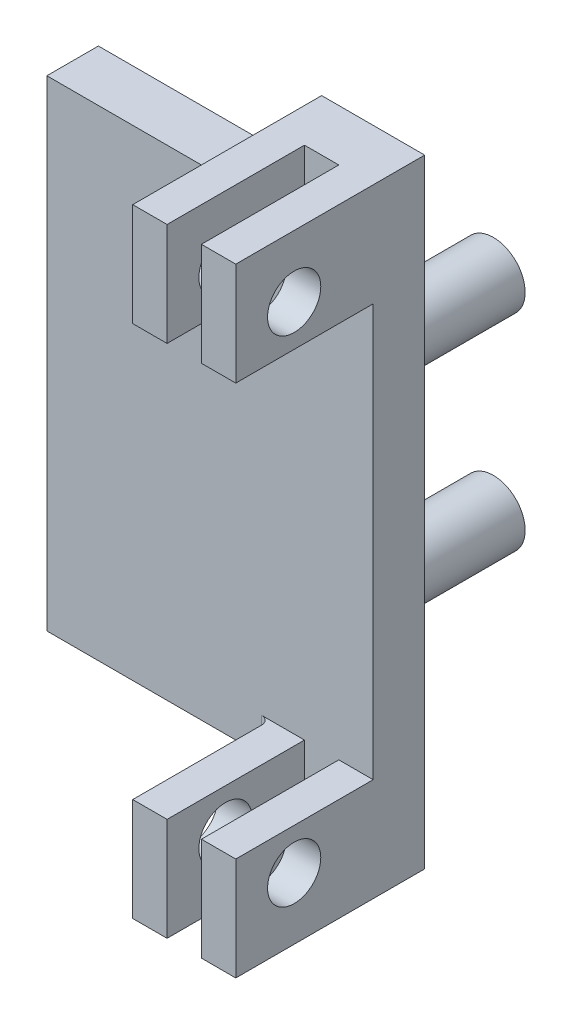
ISO-10303-21;
HEADER;
FILE_DESCRIPTION(('STEP AP214'),'2;1');
FILE_NAME('part.step','',(''),(''),'','','');
FILE_SCHEMA(('AUTOMOTIVE_DESIGN { 1 0 10303 214 1 1 1 1 }'));
ENDSEC;
DATA;
#1=APPLICATION_CONTEXT('core data for automotive mechanical design processes');
#2=APPLICATION_PROTOCOL_DEFINITION('international standard','automotive_design',2000,#1);
#3=PRODUCT_CONTEXT('',#1,'mechanical');
#4=PRODUCT('Part','Part','',(#3));
#5=PRODUCT_RELATED_PRODUCT_CATEGORY('part','',(#4));
#6=PRODUCT_DEFINITION_FORMATION('','',#4);
#7=PRODUCT_DEFINITION_CONTEXT('part definition',#1,'design');
#8=PRODUCT_DEFINITION('design','',#6,#7);
#9=PRODUCT_DEFINITION_SHAPE('','',#8);
#10=(LENGTH_UNIT() NAMED_UNIT(*) SI_UNIT(.MILLI.,.METRE.));
#11=(NAMED_UNIT(*) PLANE_ANGLE_UNIT() SI_UNIT($,.RADIAN.));
#12=(NAMED_UNIT(*) SI_UNIT($,.STERADIAN.) SOLID_ANGLE_UNIT());
#13=UNCERTAINTY_MEASURE_WITH_UNIT(LENGTH_MEASURE(1.E-05),#10,'distance_accuracy_value','');
#14=(GEOMETRIC_REPRESENTATION_CONTEXT(3) GLOBAL_UNCERTAINTY_ASSIGNED_CONTEXT((#13)) GLOBAL_UNIT_ASSIGNED_CONTEXT((#10,
#11,#12)) REPRESENTATION_CONTEXT('',''));
#15=CARTESIAN_POINT('',(0.,0.,0.));
#16=DIRECTION('',(0.,0.,1.));
#17=DIRECTION('',(1.,0.,0.));
#18=AXIS2_PLACEMENT_3D('',#15,#16,#17);
#19=CARTESIAN_POINT('',(0.,0.,3.));
#20=DIRECTION('',(0.,0.,1.));
#21=DIRECTION('',(1.,0.,0.));
#22=AXIS2_PLACEMENT_3D('',#19,#20,#21);
#23=PLANE('',#22);
#24=DIRECTION('',(1.,0.,0.));
#25=VECTOR('',#24,1.);
#26=CARTESIAN_POINT('',(0.,12.,3.));
#27=LINE('',#26,#25);
#28=CARTESIAN_POINT('',(52.50000000001,12.,3.));
#29=VERTEX_POINT('',#28);
#30=CARTESIAN_POINT('',(55.00000000001,12.,3.));
#31=VERTEX_POINT('',#30);
#32=EDGE_CURVE('E186',#29,#31,#27,.T.);
#33=ORIENTED_EDGE('',*,*,#32,.F.);
#34=DIRECTION('',(0.,-1.,0.));
#35=VECTOR('',#34,1.);
#36=CARTESIAN_POINT('',(52.50000000001,14.00000000001,3.));
#37=LINE('',#36,#35);
#38=CARTESIAN_POINT('',(52.50000000001,14.00000000001,3.));
#39=VERTEX_POINT('',#38);
#40=EDGE_CURVE('E382',#29,#39,#37,.F.);
#41=ORIENTED_EDGE('',*,*,#40,.T.);
#42=DIRECTION('',(1.,0.,0.));
#43=VECTOR('',#42,1.);
#44=CARTESIAN_POINT('',(0.,14.00000000001,3.));
#45=LINE('',#44,#43);
#46=CARTESIAN_POINT('',(40.00000000001,14.00000000001,3.));
#47=VERTEX_POINT('',#46);
#48=EDGE_CURVE('E326',#47,#39,#45,.T.);
#49=ORIENTED_EDGE('',*,*,#48,.F.);
#50=DIRECTION('',(0.,1.,0.));
#51=VECTOR('',#50,1.);
#52=CARTESIAN_POINT('',(40.00000000001,0.,3.));
#53=LINE('',#52,#51);
#54=CARTESIAN_POINT('',(40.00000000001,-14.00000000001,3.));
#55=VERTEX_POINT('',#54);
#56=EDGE_CURVE('E329',#55,#47,#53,.T.);
#57=ORIENTED_EDGE('',*,*,#56,.F.);
#58=DIRECTION('',(1.,0.,0.));
#59=VECTOR('',#58,1.);
#60=CARTESIAN_POINT('',(0.,-14.00000000001,3.));
#61=LINE('',#60,#59);
#62=CARTESIAN_POINT('',(52.50000000001,-14.00000000001,3.));
#63=VERTEX_POINT('',#62);
#64=EDGE_CURVE('E320',#55,#63,#61,.T.);
#65=ORIENTED_EDGE('',*,*,#64,.T.);
#66=DIRECTION('',(0.,-1.,0.));
#67=VECTOR('',#66,1.);
#68=CARTESIAN_POINT('',(52.50000000001,-12.,3.));
#69=LINE('',#68,#67);
#70=CARTESIAN_POINT('',(52.50000000001,-12.,3.));
#71=VERTEX_POINT('',#70);
#72=EDGE_CURVE('E379',#63,#71,#69,.F.);
#73=ORIENTED_EDGE('',*,*,#72,.T.);
#74=DIRECTION('',(-1.,0.,0.));
#75=VECTOR('',#74,1.);
#76=CARTESIAN_POINT('',(0.,-12.,3.));
#77=LINE('',#76,#75);
#78=CARTESIAN_POINT('',(55.00000000001,-12.,3.));
#79=VERTEX_POINT('',#78);
#80=EDGE_CURVE('E244',#79,#71,#77,.T.);
#81=ORIENTED_EDGE('',*,*,#80,.F.);
#82=DIRECTION('',(0.,1.,0.));
#83=VECTOR('',#82,1.);
#84=CARTESIAN_POINT('',(55.00000000001,0.,3.));
#85=LINE('',#84,#83);
#86=CARTESIAN_POINT('',(55.00000000001,-18.,3.));
#87=VERTEX_POINT('',#86);
#88=EDGE_CURVE('E239',#87,#79,#85,.T.);
#89=ORIENTED_EDGE('',*,*,#88,.F.);
#90=DIRECTION('',(1.,0.,0.));
#91=VECTOR('',#90,1.);
#92=CARTESIAN_POINT('',(0.,-18.,3.));
#93=LINE('',#92,#91);
#94=CARTESIAN_POINT('',(57.00000000001,-18.,3.));
#95=VERTEX_POINT('',#94);
#96=EDGE_CURVE('E301',#87,#95,#93,.T.);
#97=ORIENTED_EDGE('',*,*,#96,.T.);
#98=DIRECTION('',(0.,1.,0.));
#99=VECTOR('',#98,1.);
#100=CARTESIAN_POINT('',(57.00000000001,0.,3.));
#101=LINE('',#100,#99);
#102=CARTESIAN_POINT('',(57.00000000001,-12.,3.));
#103=VERTEX_POINT('',#102);
#104=EDGE_CURVE('E267',#95,#103,#101,.T.);
#105=ORIENTED_EDGE('',*,*,#104,.T.);
#106=DIRECTION('',(1.,0.,0.));
#107=VECTOR('',#106,1.);
#108=CARTESIAN_POINT('',(0.,-12.,3.));
#109=LINE('',#108,#107);
#110=CARTESIAN_POINT('',(59.00000000001,-12.,3.));
#111=VERTEX_POINT('',#110);
#112=EDGE_CURVE('E262',#103,#111,#109,.T.);
#113=ORIENTED_EDGE('',*,*,#112,.T.);
#114=DIRECTION('',(0.,1.,0.));
#115=VECTOR('',#114,1.);
#116=CARTESIAN_POINT('',(59.00000000001,0.,3.));
#117=LINE('',#116,#115);
#118=CARTESIAN_POINT('',(59.00000000001,12.,3.));
#119=VERTEX_POINT('',#118);
#120=EDGE_CURVE('E323',#111,#119,#117,.T.);
#121=ORIENTED_EDGE('',*,*,#120,.T.);
#122=DIRECTION('',(1.,0.,0.));
#123=VECTOR('',#122,1.);
#124=CARTESIAN_POINT('',(0.,12.,3.));
#125=LINE('',#124,#123);
#126=CARTESIAN_POINT('',(57.00000000001,12.,3.));
#127=VERTEX_POINT('',#126);
#128=EDGE_CURVE('E202',#127,#119,#125,.T.);
#129=ORIENTED_EDGE('',*,*,#128,.F.);
#130=DIRECTION('',(0.,1.,0.));
#131=VECTOR('',#130,1.);
#132=CARTESIAN_POINT('',(57.00000000001,0.,3.));
#133=LINE('',#132,#131);
#134=CARTESIAN_POINT('',(57.00000000001,18.,3.));
#135=VERTEX_POINT('',#134);
#136=EDGE_CURVE('E183',#127,#135,#133,.T.);
#137=ORIENTED_EDGE('',*,*,#136,.T.);
#138=DIRECTION('',(-1.,0.,0.));
#139=VECTOR('',#138,1.);
#140=CARTESIAN_POINT('',(0.,18.,3.));
#141=LINE('',#140,#139);
#142=CARTESIAN_POINT('',(55.00000000001,18.,3.));
#143=VERTEX_POINT('',#142);
#144=EDGE_CURVE('E291',#135,#143,#141,.T.);
#145=ORIENTED_EDGE('',*,*,#144,.T.);
#146=DIRECTION('',(0.,-1.,0.));
#147=VECTOR('',#146,1.);
#148=CARTESIAN_POINT('',(55.00000000001,0.,3.));
#149=LINE('',#148,#147);
#150=EDGE_CURVE('E219',#143,#31,#149,.T.);
#151=ORIENTED_EDGE('',*,*,#150,.T.);
#152=EDGE_LOOP('',(#33,#41,#49,#57,#65,#73,#81,#89,#97,#105,#113,#121,#129,#137,#145,#151));
#153=FACE_BOUND('',#152,.T.);
#154=ADVANCED_FACE('F17',(#153),#23,.T.);
#155=CARTESIAN_POINT('',(0.,-14.00000000001,3.));
#156=DIRECTION('',(0.,1.,0.));
#157=DIRECTION('',(0.,0.,1.));
#158=AXIS2_PLACEMENT_3D('',#155,#156,#157);
#159=PLANE('',#158);
#160=DIRECTION('',(1.,0.,0.));
#161=VECTOR('',#160,1.);
#162=CARTESIAN_POINT('',(0.,-14.00000000001,0.));
#163=LINE('',#162,#161);
#164=CARTESIAN_POINT('',(40.00000000001,-14.00000000001,0.));
#165=VERTEX_POINT('',#164);
#166=CARTESIAN_POINT('',(52.50000000001,-14.00000000001,0.));
#167=VERTEX_POINT('',#166);
#168=EDGE_CURVE('E319',#165,#167,#163,.T.);
#169=ORIENTED_EDGE('',*,*,#168,.T.);
#170=DIRECTION('',(0.,0.,1.));
#171=VECTOR('',#170,1.);
#172=CARTESIAN_POINT('',(52.50000000001,-14.00000000001,3.));
#173=LINE('',#172,#171);
#174=EDGE_CURVE('E389',#167,#63,#173,.T.);
#175=ORIENTED_EDGE('',*,*,#174,.T.);
#176=ORIENTED_EDGE('',*,*,#64,.F.);
#177=DIRECTION('',(0.,0.,-1.));
#178=VECTOR('',#177,1.);
#179=CARTESIAN_POINT('',(40.00000000001,-14.00000000001,3.));
#180=LINE('',#179,#178);
#181=EDGE_CURVE('E332',#55,#165,#180,.T.);
#182=ORIENTED_EDGE('',*,*,#181,.T.);
#183=EDGE_LOOP('',(#169,#175,#176,#182));
#184=FACE_BOUND('',#183,.T.);
#185=ADVANCED_FACE('F442',(#184),#159,.F.);
#186=CARTESIAN_POINT('',(59.00000000001,0.,3.));
#187=DIRECTION('',(-1.,0.,0.));
#188=DIRECTION('',(0.,0.,1.));
#189=AXIS2_PLACEMENT_3D('',#186,#187,#188);
#190=PLANE('',#189);
#191=CARTESIAN_POINT('',(59.00000000001,14.4,7.6));
#192=DIRECTION('',(1.,0.,0.));
#193=DIRECTION('',(0.,0.,-1.));
#194=AXIS2_PLACEMENT_3D('',#191,#192,#193);
#195=CIRCLE('',#194,1.55);
#196=CARTESIAN_POINT('',(59.00000000001,14.4,6.05));
#197=VERTEX_POINT('',#196);
#198=EDGE_CURVE('E367',#197,#197,#195,.T.);
#199=ORIENTED_EDGE('',*,*,#198,.F.);
#200=EDGE_LOOP('',(#199));
#201=FACE_BOUND('',#200,.T.);
#202=CARTESIAN_POINT('',(59.00000000001,-14.4,7.6));
#203=DIRECTION('',(1.,0.,0.));
#204=DIRECTION('',(0.,0.,-1.));
#205=AXIS2_PLACEMENT_3D('',#202,#203,#204);
#206=CIRCLE('',#205,1.55);
#207=CARTESIAN_POINT('',(59.00000000001,-14.4,6.05));
#208=VERTEX_POINT('',#207);
#209=EDGE_CURVE('E397',#208,#208,#206,.T.);
#210=ORIENTED_EDGE('',*,*,#209,.F.);
#211=EDGE_LOOP('',(#210));
#212=FACE_BOUND('',#211,.T.);
#213=DIRECTION('',(0.,1.,0.));
#214=VECTOR('',#213,1.);
#215=CARTESIAN_POINT('',(59.00000000001,0.,0.));
#216=LINE('',#215,#214);
#217=CARTESIAN_POINT('',(59.00000000001,-18.,0.));
#218=VERTEX_POINT('',#217);
#219=CARTESIAN_POINT('',(59.00000000001,18.,0.));
#220=VERTEX_POINT('',#219);
#221=EDGE_CURVE('E334',#218,#220,#216,.T.);
#222=ORIENTED_EDGE('',*,*,#221,.T.);
#223=DIRECTION('',(0.,0.,1.));
#224=VECTOR('',#223,1.);
#225=CARTESIAN_POINT('',(59.00000000001,18.,0.));
#226=LINE('',#225,#224);
#227=CARTESIAN_POINT('',(59.00000000001,18.,11.));
#228=VERTEX_POINT('',#227);
#229=EDGE_CURVE('E287',#220,#228,#226,.T.);
#230=ORIENTED_EDGE('',*,*,#229,.T.);
#231=DIRECTION('',(0.,-1.,0.));
#232=VECTOR('',#231,1.);
#233=CARTESIAN_POINT('',(59.00000000001,0.,11.));
#234=LINE('',#233,#232);
#235=CARTESIAN_POINT('',(59.00000000001,12.,11.));
#236=VERTEX_POINT('',#235);
#237=EDGE_CURVE('E196',#228,#236,#234,.T.);
#238=ORIENTED_EDGE('',*,*,#237,.T.);
#239=DIRECTION('',(0.,0.,-1.));
#240=VECTOR('',#239,1.);
#241=CARTESIAN_POINT('',(59.00000000001,12.,11.));
#242=LINE('',#241,#240);
#243=EDGE_CURVE('E187',#236,#119,#242,.T.);
#244=ORIENTED_EDGE('',*,*,#243,.T.);
#245=ORIENTED_EDGE('',*,*,#120,.F.);
#246=DIRECTION('',(0.,0.,-1.));
#247=VECTOR('',#246,1.);
#248=CARTESIAN_POINT('',(59.00000000001,-12.,11.));
#249=LINE('',#248,#247);
#250=CARTESIAN_POINT('',(59.00000000001,-12.,11.));
#251=VERTEX_POINT('',#250);
#252=EDGE_CURVE('E275',#251,#111,#249,.T.);
#253=ORIENTED_EDGE('',*,*,#252,.F.);
#254=DIRECTION('',(0.,1.,0.));
#255=VECTOR('',#254,1.);
#256=CARTESIAN_POINT('',(59.00000000001,0.,11.));
#257=LINE('',#256,#255);
#258=CARTESIAN_POINT('',(59.00000000001,-18.,11.));
#259=VERTEX_POINT('',#258);
#260=EDGE_CURVE('E273',#259,#251,#257,.T.);
#261=ORIENTED_EDGE('',*,*,#260,.F.);
#262=DIRECTION('',(0.,0.,1.));
#263=VECTOR('',#262,1.);
#264=CARTESIAN_POINT('',(59.00000000001,-18.,0.));
#265=LINE('',#264,#263);
#266=EDGE_CURVE('E307',#218,#259,#265,.T.);
#267=ORIENTED_EDGE('',*,*,#266,.F.);
#268=EDGE_LOOP('',(#222,#230,#238,#244,#245,#253,#261,#267));
#269=FACE_BOUND('',#268,.T.);
#270=ADVANCED_FACE('F473',(#201,#212,#269),#190,.F.);
#271=CARTESIAN_POINT('',(0.,14.00000000001,3.));
#272=DIRECTION('',(0.,1.,0.));
#273=DIRECTION('',(0.,0.,1.));
#274=AXIS2_PLACEMENT_3D('',#271,#272,#273);
#275=PLANE('',#274);
#276=ORIENTED_EDGE('',*,*,#48,.T.);
#277=DIRECTION('',(0.,0.,1.));
#278=VECTOR('',#277,1.);
#279=CARTESIAN_POINT('',(52.50000000001,14.00000000001,0.));
#280=LINE('',#279,#278);
#281=CARTESIAN_POINT('',(52.50000000001,14.00000000001,0.));
#282=VERTEX_POINT('',#281);
#283=EDGE_CURVE('E377',#39,#282,#280,.F.);
#284=ORIENTED_EDGE('',*,*,#283,.T.);
#285=DIRECTION('',(1.,0.,0.));
#286=VECTOR('',#285,1.);
#287=CARTESIAN_POINT('',(0.,14.00000000001,0.));
#288=LINE('',#287,#286);
#289=CARTESIAN_POINT('',(40.00000000001,14.00000000001,0.));
#290=VERTEX_POINT('',#289);
#291=EDGE_CURVE('E336',#290,#282,#288,.T.);
#292=ORIENTED_EDGE('',*,*,#291,.F.);
#293=DIRECTION('',(0.,0.,-1.));
#294=VECTOR('',#293,1.);
#295=CARTESIAN_POINT('',(40.00000000001,14.00000000001,3.));
#296=LINE('',#295,#294);
#297=EDGE_CURVE('E342',#47,#290,#296,.T.);
#298=ORIENTED_EDGE('',*,*,#297,.F.);
#299=EDGE_LOOP('',(#276,#284,#292,#298));
#300=FACE_BOUND('',#299,.T.);
#301=ADVANCED_FACE('F491',(#300),#275,.T.);
#302=CARTESIAN_POINT('',(40.00000000001,0.,3.));
#303=DIRECTION('',(-1.,0.,0.));
#304=DIRECTION('',(0.,0.,1.));
#305=AXIS2_PLACEMENT_3D('',#302,#303,#304);
#306=PLANE('',#305);
#307=DIRECTION('',(0.,1.,0.));
#308=VECTOR('',#307,1.);
#309=CARTESIAN_POINT('',(40.00000000001,0.,0.));
#310=LINE('',#309,#308);
#311=EDGE_CURVE('E324',#165,#290,#310,.T.);
#312=ORIENTED_EDGE('',*,*,#311,.F.);
#313=ORIENTED_EDGE('',*,*,#181,.F.);
#314=ORIENTED_EDGE('',*,*,#56,.T.);
#315=ORIENTED_EDGE('',*,*,#297,.T.);
#316=EDGE_LOOP('',(#312,#313,#314,#315));
#317=FACE_BOUND('',#316,.T.);
#318=ADVANCED_FACE('F525',(#317),#306,.T.);
#319=CARTESIAN_POINT('',(0.,0.,0.));
#320=DIRECTION('',(0.,0.,1.));
#321=DIRECTION('',(1.,0.,0.));
#322=AXIS2_PLACEMENT_3D('',#319,#320,#321);
#323=PLANE('',#322);
#324=DIRECTION('',(-1.,0.,0.));
#325=VECTOR('',#324,1.);
#326=CARTESIAN_POINT('',(0.,18.,0.));
#327=LINE('',#326,#325);
#328=CARTESIAN_POINT('',(53.00000000001,18.,0.));
#329=VERTEX_POINT('',#328);
#330=EDGE_CURVE('E294',#220,#329,#327,.T.);
#331=ORIENTED_EDGE('',*,*,#330,.F.);
#332=ORIENTED_EDGE('',*,*,#221,.F.);
#333=DIRECTION('',(1.,0.,0.));
#334=VECTOR('',#333,1.);
#335=CARTESIAN_POINT('',(0.,-18.,0.));
#336=LINE('',#335,#334);
#337=CARTESIAN_POINT('',(53.00000000001,-18.,0.));
#338=VERTEX_POINT('',#337);
#339=EDGE_CURVE('E290',#338,#218,#336,.T.);
#340=ORIENTED_EDGE('',*,*,#339,.F.);
#341=DIRECTION('',(0.,-1.,0.));
#342=VECTOR('',#341,1.);
#343=CARTESIAN_POINT('',(53.00000000001,0.,0.));
#344=LINE('',#343,#342);
#345=CARTESIAN_POINT('',(53.00000000001,-14.50000000001,0.));
#346=VERTEX_POINT('',#345);
#347=EDGE_CURVE('E288',#346,#338,#344,.T.);
#348=ORIENTED_EDGE('',*,*,#347,.F.);
#349=CARTESIAN_POINT('',(52.50000000001,-14.50000000001,0.));
#350=DIRECTION('',(0.,0.,1.));
#351=DIRECTION('',(1.,0.,0.));
#352=AXIS2_PLACEMENT_3D('',#349,#350,#351);
#353=CIRCLE('',#352,0.5);
#354=EDGE_CURVE('E11',#346,#167,#353,.T.);
#355=ORIENTED_EDGE('',*,*,#354,.T.);
#356=ORIENTED_EDGE('',*,*,#168,.F.);
#357=ORIENTED_EDGE('',*,*,#311,.T.);
#358=ORIENTED_EDGE('',*,*,#291,.T.);
#359=CARTESIAN_POINT('',(52.50000000001,14.50000000001,0.));
#360=DIRECTION('',(0.,0.,1.));
#361=DIRECTION('',(1.,0.,0.));
#362=AXIS2_PLACEMENT_3D('',#359,#360,#361);
#363=CIRCLE('',#362,0.5);
#364=CARTESIAN_POINT('',(53.00000000001,14.50000000001,0.));
#365=VERTEX_POINT('',#364);
#366=EDGE_CURVE('E391',#282,#365,#363,.T.);
#367=ORIENTED_EDGE('',*,*,#366,.T.);
#368=DIRECTION('',(0.,-1.,0.));
#369=VECTOR('',#368,1.);
#370=CARTESIAN_POINT('',(53.00000000001,0.,0.));
#371=LINE('',#370,#369);
#372=EDGE_CURVE('E297',#329,#365,#371,.T.);
#373=ORIENTED_EDGE('',*,*,#372,.F.);
#374=EDGE_LOOP('',(#331,#332,#340,#348,#355,#356,#357,#358,#367,#373));
#375=FACE_BOUND('',#374,.T.);
#376=CARTESIAN_POINT('',(55.00000000001,6.00000000000997,0.));
#377=DIRECTION('',(0.,0.,1.));
#378=DIRECTION('',(1.,0.,0.));
#379=AXIS2_PLACEMENT_3D('',#376,#377,#378);
#380=CIRCLE('',#379,2.35);
#381=CARTESIAN_POINT('',(57.35000000001,6.00000000000997,0.));
#382=VERTEX_POINT('',#381);
#383=EDGE_CURVE('E350',#382,#382,#380,.T.);
#384=ORIENTED_EDGE('',*,*,#383,.T.);
#385=EDGE_LOOP('',(#384));
#386=FACE_BOUND('',#385,.T.);
#387=CARTESIAN_POINT('',(55.00000000001,-6.00000000001003,0.));
#388=DIRECTION('',(0.,0.,1.));
#389=DIRECTION('',(1.,0.,0.));
#390=AXIS2_PLACEMENT_3D('',#387,#388,#389);
#391=CIRCLE('',#390,2.35);
#392=CARTESIAN_POINT('',(57.35000000001,-6.00000000001003,0.));
#393=VERTEX_POINT('',#392);
#394=EDGE_CURVE('E347',#393,#393,#391,.T.);
#395=ORIENTED_EDGE('',*,*,#394,.T.);
#396=EDGE_LOOP('',(#395));
#397=FACE_BOUND('',#396,.T.);
#398=CARTESIAN_POINT('',(46.00000000001,0.,0.));
#399=DIRECTION('',(0.,0.,1.));
#400=DIRECTION('',(1.,0.,0.));
#401=AXIS2_PLACEMENT_3D('',#398,#399,#400);
#402=CIRCLE('',#401,3.6);
#403=CARTESIAN_POINT('',(49.60000000001,0.,0.));
#404=VERTEX_POINT('',#403);
#405=EDGE_CURVE('E344',#404,#404,#402,.T.);
#406=ORIENTED_EDGE('',*,*,#405,.T.);
#407=EDGE_LOOP('',(#406));
#408=FACE_BOUND('',#407,.T.);
#409=ADVANCED_FACE('F448',(#375,#386,#397,#408),#323,.F.);
#410=CARTESIAN_POINT('',(46.00000000001,0.,-8.));
#411=DIRECTION('',(0.,0.,1.));
#412=DIRECTION('',(1.,0.,0.));
#413=AXIS2_PLACEMENT_3D('',#410,#411,#412);
#414=CYLINDRICAL_SURFACE('',#413,3.1);
#415=CARTESIAN_POINT('',(46.00000000001,0.,-0.5));
#416=DIRECTION('',(0.,0.,1.));
#417=DIRECTION('',(1.,0.,0.));
#418=AXIS2_PLACEMENT_3D('',#415,#416,#417);
#419=CIRCLE('',#418,3.1);
#420=CARTESIAN_POINT('',(49.10000000001,0.,-0.5));
#421=VERTEX_POINT('',#420);
#422=EDGE_CURVE('E359',#421,#421,#419,.F.);
#423=ORIENTED_EDGE('',*,*,#422,.T.);
#424=EDGE_LOOP('',(#423));
#425=FACE_BOUND('',#424,.T.);
#426=CARTESIAN_POINT('',(46.00000000001,0.,-8.));
#427=DIRECTION('',(0.,0.,1.));
#428=DIRECTION('',(1.,0.,0.));
#429=AXIS2_PLACEMENT_3D('',#426,#427,#428);
#430=CIRCLE('',#429,3.1);
#431=CARTESIAN_POINT('',(49.10000000001,0.,-8.));
#432=VERTEX_POINT('',#431);
#433=EDGE_CURVE('E316',#432,#432,#430,.T.);
#434=ORIENTED_EDGE('',*,*,#433,.T.);
#435=EDGE_LOOP('',(#434));
#436=FACE_BOUND('',#435,.T.);
#437=ADVANCED_FACE('F521',(#425,#436),#414,.T.);
#438=CARTESIAN_POINT('',(0.,0.,-8.));
#439=DIRECTION('',(0.,0.,1.));
#440=DIRECTION('',(1.,0.,0.));
#441=AXIS2_PLACEMENT_3D('',#438,#439,#440);
#442=PLANE('',#441);
#443=ORIENTED_EDGE('',*,*,#433,.F.);
#444=EDGE_LOOP('',(#443));
#445=FACE_BOUND('',#444,.T.);
#446=ADVANCED_FACE('F798',(#445),#442,.F.);
#447=CARTESIAN_POINT('',(55.00000000001,-6.00000000001003,-8.));
#448=DIRECTION('',(0.,0.,1.));
#449=DIRECTION('',(1.,0.,0.));
#450=AXIS2_PLACEMENT_3D('',#447,#448,#449);
#451=CYLINDRICAL_SURFACE('',#450,1.85);
#452=CARTESIAN_POINT('',(55.00000000001,-6.00000000001003,-0.5));
#453=DIRECTION('',(0.,0.,1.));
#454=DIRECTION('',(1.,0.,0.));
#455=AXIS2_PLACEMENT_3D('',#452,#453,#454);
#456=CIRCLE('',#455,1.85);
#457=CARTESIAN_POINT('',(56.85000000001,-6.00000000001003,-0.5));
#458=VERTEX_POINT('',#457);
#459=EDGE_CURVE('E356',#458,#458,#456,.F.);
#460=ORIENTED_EDGE('',*,*,#459,.T.);
#461=EDGE_LOOP('',(#460));
#462=FACE_BOUND('',#461,.T.);
#463=CARTESIAN_POINT('',(55.00000000001,-6.00000000001003,-8.));
#464=DIRECTION('',(0.,0.,1.));
#465=DIRECTION('',(1.,0.,0.));
#466=AXIS2_PLACEMENT_3D('',#463,#464,#465);
#467=CIRCLE('',#466,1.85);
#468=CARTESIAN_POINT('',(56.85000000001,-6.00000000001003,-8.));
#469=VERTEX_POINT('',#468);
#470=EDGE_CURVE('E313',#469,#469,#467,.T.);
#471=ORIENTED_EDGE('',*,*,#470,.T.);
#472=EDGE_LOOP('',(#471));
#473=FACE_BOUND('',#472,.T.);
#474=ADVANCED_FACE('F787',(#462,#473),#451,.T.);
#475=CARTESIAN_POINT('',(0.,0.,-8.));
#476=DIRECTION('',(0.,0.,1.));
#477=DIRECTION('',(1.,0.,0.));
#478=AXIS2_PLACEMENT_3D('',#475,#476,#477);
#479=PLANE('',#478);
#480=ORIENTED_EDGE('',*,*,#470,.F.);
#481=EDGE_LOOP('',(#480));
#482=FACE_BOUND('',#481,.T.);
#483=ADVANCED_FACE('F776',(#482),#479,.F.);
#484=CARTESIAN_POINT('',(55.00000000001,6.00000000000997,-8.));
#485=DIRECTION('',(0.,0.,1.));
#486=DIRECTION('',(1.,0.,0.));
#487=AXIS2_PLACEMENT_3D('',#484,#485,#486);
#488=CYLINDRICAL_SURFACE('',#487,1.85);
#489=CARTESIAN_POINT('',(55.00000000001,6.00000000000997,-0.5));
#490=DIRECTION('',(0.,0.,1.));
#491=DIRECTION('',(1.,0.,0.));
#492=AXIS2_PLACEMENT_3D('',#489,#490,#491);
#493=CIRCLE('',#492,1.85);
#494=CARTESIAN_POINT('',(56.85000000001,6.00000000000997,-0.5));
#495=VERTEX_POINT('',#494);
#496=EDGE_CURVE('E353',#495,#495,#493,.F.);
#497=ORIENTED_EDGE('',*,*,#496,.T.);
#498=EDGE_LOOP('',(#497));
#499=FACE_BOUND('',#498,.T.);
#500=CARTESIAN_POINT('',(55.00000000001,6.00000000000997,-8.));
#501=DIRECTION('',(0.,0.,1.));
#502=DIRECTION('',(1.,0.,0.));
#503=AXIS2_PLACEMENT_3D('',#500,#501,#502);
#504=CIRCLE('',#503,1.85);
#505=CARTESIAN_POINT('',(56.85000000001,6.00000000000997,-8.));
#506=VERTEX_POINT('',#505);
#507=EDGE_CURVE('E306',#506,#506,#504,.T.);
#508=ORIENTED_EDGE('',*,*,#507,.T.);
#509=EDGE_LOOP('',(#508));
#510=FACE_BOUND('',#509,.T.);
#511=ADVANCED_FACE('F765',(#499,#510),#488,.T.);
#512=CARTESIAN_POINT('',(0.,0.,-8.));
#513=DIRECTION('',(0.,0.,1.));
#514=DIRECTION('',(1.,0.,0.));
#515=AXIS2_PLACEMENT_3D('',#512,#513,#514);
#516=PLANE('',#515);
#517=ORIENTED_EDGE('',*,*,#507,.F.);
#518=EDGE_LOOP('',(#517));
#519=FACE_BOUND('',#518,.T.);
#520=ADVANCED_FACE('F538',(#519),#516,.F.);
#521=CARTESIAN_POINT('',(55.00000000001,6.00000000000997,-0.5));
#522=DIRECTION('',(0.,0.,1.));
#523=DIRECTION('',(1.,0.,0.));
#524=AXIS2_PLACEMENT_3D('',#521,#522,#523);
#525=TOROIDAL_SURFACE('',#524,2.35,0.5);
#526=ORIENTED_EDGE('',*,*,#496,.F.);
#527=EDGE_LOOP('',(#526));
#528=FACE_BOUND('',#527,.T.);
#529=ORIENTED_EDGE('',*,*,#383,.F.);
#530=EDGE_LOOP('',(#529));
#531=FACE_BOUND('',#530,.T.);
#532=ADVANCED_FACE('F534',(#528,#531),#525,.F.);
#533=CARTESIAN_POINT('',(55.00000000001,-6.00000000001003,-0.5));
#534=DIRECTION('',(0.,0.,1.));
#535=DIRECTION('',(1.,0.,0.));
#536=AXIS2_PLACEMENT_3D('',#533,#534,#535);
#537=TOROIDAL_SURFACE('',#536,2.35,0.5);
#538=ORIENTED_EDGE('',*,*,#459,.F.);
#539=EDGE_LOOP('',(#538));
#540=FACE_BOUND('',#539,.T.);
#541=ORIENTED_EDGE('',*,*,#394,.F.);
#542=EDGE_LOOP('',(#541));
#543=FACE_BOUND('',#542,.T.);
#544=ADVANCED_FACE('F537',(#540,#543),#537,.F.);
#545=CARTESIAN_POINT('',(46.00000000001,0.,-0.5));
#546=DIRECTION('',(0.,0.,1.));
#547=DIRECTION('',(1.,0.,0.));
#548=AXIS2_PLACEMENT_3D('',#545,#546,#547);
#549=TOROIDAL_SURFACE('',#548,3.6,0.5);
#550=ORIENTED_EDGE('',*,*,#422,.F.);
#551=EDGE_LOOP('',(#550));
#552=FACE_BOUND('',#551,.T.);
#553=ORIENTED_EDGE('',*,*,#405,.F.);
#554=EDGE_LOOP('',(#553));
#555=FACE_BOUND('',#554,.T.);
#556=ADVANCED_FACE('F542',(#552,#555),#549,.F.);
#557=CARTESIAN_POINT('',(0.,18.,0.));
#558=DIRECTION('',(0.,1.,0.));
#559=DIRECTION('',(0.,0.,1.));
#560=AXIS2_PLACEMENT_3D('',#557,#558,#559);
#561=PLANE('',#560);
#562=ORIENTED_EDGE('',*,*,#144,.F.);
#563=DIRECTION('',(0.,0.,-1.));
#564=VECTOR('',#563,1.);
#565=CARTESIAN_POINT('',(57.00000000001,18.,11.));
#566=LINE('',#565,#564);
#567=CARTESIAN_POINT('',(57.00000000001,18.,11.));
#568=VERTEX_POINT('',#567);
#569=EDGE_CURVE('E211',#568,#135,#566,.T.);
#570=ORIENTED_EDGE('',*,*,#569,.F.);
#571=DIRECTION('',(-1.,0.,0.));
#572=VECTOR('',#571,1.);
#573=CARTESIAN_POINT('',(0.,18.,11.));
#574=LINE('',#573,#572);
#575=EDGE_CURVE('E200',#228,#568,#574,.T.);
#576=ORIENTED_EDGE('',*,*,#575,.F.);
#577=ORIENTED_EDGE('',*,*,#229,.F.);
#578=ORIENTED_EDGE('',*,*,#330,.T.);
#579=DIRECTION('',(0.,0.,1.));
#580=VECTOR('',#579,1.);
#581=CARTESIAN_POINT('',(53.00000000001,18.,0.));
#582=LINE('',#581,#580);
#583=CARTESIAN_POINT('',(53.00000000001,18.,11.));
#584=VERTEX_POINT('',#583);
#585=EDGE_CURVE('E304',#329,#584,#582,.T.);
#586=ORIENTED_EDGE('',*,*,#585,.T.);
#587=DIRECTION('',(-1.,0.,0.));
#588=VECTOR('',#587,1.);
#589=CARTESIAN_POINT('',(0.,18.,11.));
#590=LINE('',#589,#588);
#591=CARTESIAN_POINT('',(55.00000000001,18.,11.));
#592=VERTEX_POINT('',#591);
#593=EDGE_CURVE('E224',#592,#584,#590,.T.);
#594=ORIENTED_EDGE('',*,*,#593,.F.);
#595=DIRECTION('',(0.,0.,-1.));
#596=VECTOR('',#595,1.);
#597=CARTESIAN_POINT('',(55.00000000001,18.,11.));
#598=LINE('',#597,#596);
#599=EDGE_CURVE('E227',#592,#143,#598,.T.);
#600=ORIENTED_EDGE('',*,*,#599,.T.);
#601=EDGE_LOOP('',(#562,#570,#576,#577,#578,#586,#594,#600));
#602=FACE_BOUND('',#601,.T.);
#603=ADVANCED_FACE('F476',(#602),#561,.T.);
#604=CARTESIAN_POINT('',(53.00000000001,0.,0.));
#605=DIRECTION('',(-1.,0.,0.));
#606=DIRECTION('',(0.,0.,1.));
#607=AXIS2_PLACEMENT_3D('',#604,#605,#606);
#608=PLANE('',#607);
#609=CARTESIAN_POINT('',(53.00000000001,14.4,7.6));
#610=DIRECTION('',(-1.,0.,0.));
#611=DIRECTION('',(0.,0.,1.));
#612=AXIS2_PLACEMENT_3D('',#609,#610,#611);
#613=CIRCLE('',#612,1.55);
#614=CARTESIAN_POINT('',(53.00000000001,14.4,9.15));
#615=VERTEX_POINT('',#614);
#616=EDGE_CURVE('E372',#615,#615,#613,.T.);
#617=ORIENTED_EDGE('',*,*,#616,.F.);
#618=EDGE_LOOP('',(#617));
#619=FACE_BOUND('',#618,.T.);
#620=ORIENTED_EDGE('',*,*,#372,.T.);
#621=DIRECTION('',(0.,0.,1.));
#622=VECTOR('',#621,1.);
#623=CARTESIAN_POINT('',(53.00000000001,14.50000000001,3.));
#624=LINE('',#623,#622);
#625=CARTESIAN_POINT('',(53.00000000001,14.50000000001,3.5));
#626=VERTEX_POINT('',#625);
#627=EDGE_CURVE('E374',#365,#626,#624,.T.);
#628=ORIENTED_EDGE('',*,*,#627,.T.);
#629=DIRECTION('',(0.,-1.,0.));
#630=VECTOR('',#629,1.);
#631=CARTESIAN_POINT('',(53.00000000001,12.,3.5));
#632=LINE('',#631,#630);
#633=CARTESIAN_POINT('',(53.00000000001,12.,3.5));
#634=VERTEX_POINT('',#633);
#635=EDGE_CURVE('E362',#626,#634,#632,.T.);
#636=ORIENTED_EDGE('',*,*,#635,.T.);
#637=DIRECTION('',(0.,0.,-1.));
#638=VECTOR('',#637,1.);
#639=CARTESIAN_POINT('',(53.00000000001,12.,11.));
#640=LINE('',#639,#638);
#641=CARTESIAN_POINT('',(53.00000000001,12.,11.));
#642=VERTEX_POINT('',#641);
#643=EDGE_CURVE('E236',#642,#634,#640,.T.);
#644=ORIENTED_EDGE('',*,*,#643,.F.);
#645=DIRECTION('',(0.,-1.,0.));
#646=VECTOR('',#645,1.);
#647=CARTESIAN_POINT('',(53.00000000001,0.,11.));
#648=LINE('',#647,#646);
#649=EDGE_CURVE('E215',#584,#642,#648,.T.);
#650=ORIENTED_EDGE('',*,*,#649,.F.);
#651=ORIENTED_EDGE('',*,*,#585,.F.);
#652=EDGE_LOOP('',(#620,#628,#636,#644,#650,#651));
#653=FACE_BOUND('',#652,.T.);
#654=ADVANCED_FACE('F426',(#619,#653),#608,.T.);
#655=CARTESIAN_POINT('',(53.00000000001,0.,0.));
#656=DIRECTION('',(-1.,0.,0.));
#657=DIRECTION('',(0.,-1.,0.));
#658=AXIS2_PLACEMENT_3D('',#655,#656,#657);
#659=PLANE('',#658);
#660=CARTESIAN_POINT('',(53.00000000001,-14.4,7.6));
#661=DIRECTION('',(-1.,0.,0.));
#662=DIRECTION('',(0.,-1.,0.));
#663=AXIS2_PLACEMENT_3D('',#660,#661,#662);
#664=CIRCLE('',#663,1.55);
#665=CARTESIAN_POINT('',(53.00000000001,-15.95,7.6));
#666=VERTEX_POINT('',#665);
#667=EDGE_CURVE('E206',#666,#666,#664,.T.);
#668=ORIENTED_EDGE('',*,*,#667,.F.);
#669=EDGE_LOOP('',(#668));
#670=FACE_BOUND('',#669,.T.);
#671=DIRECTION('',(0.,0.,-1.));
#672=VECTOR('',#671,1.);
#673=CARTESIAN_POINT('',(53.00000000001,-12.,11.));
#674=LINE('',#673,#672);
#675=CARTESIAN_POINT('',(53.00000000001,-12.,11.));
#676=VERTEX_POINT('',#675);
#677=CARTESIAN_POINT('',(53.00000000001,-12.,3.5));
#678=VERTEX_POINT('',#677);
#679=EDGE_CURVE('E250',#676,#678,#674,.T.);
#680=ORIENTED_EDGE('',*,*,#679,.T.);
#681=DIRECTION('',(0.,-1.,0.));
#682=VECTOR('',#681,1.);
#683=CARTESIAN_POINT('',(53.00000000001,-14.00000000001,3.5));
#684=LINE('',#683,#682);
#685=CARTESIAN_POINT('',(53.00000000001,-14.50000000001,3.5));
#686=VERTEX_POINT('',#685);
#687=EDGE_CURVE('E386',#678,#686,#684,.T.);
#688=ORIENTED_EDGE('',*,*,#687,.T.);
#689=DIRECTION('',(0.,0.,1.));
#690=VECTOR('',#689,1.);
#691=CARTESIAN_POINT('',(53.00000000001,-14.50000000001,0.));
#692=LINE('',#691,#690);
#693=EDGE_CURVE('E384',#686,#346,#692,.F.);
#694=ORIENTED_EDGE('',*,*,#693,.T.);
#695=ORIENTED_EDGE('',*,*,#347,.T.);
#696=DIRECTION('',(0.,0.,1.));
#697=VECTOR('',#696,1.);
#698=CARTESIAN_POINT('',(53.00000000001,-18.,0.));
#699=LINE('',#698,#697);
#700=CARTESIAN_POINT('',(53.00000000001,-18.,11.));
#701=VERTEX_POINT('',#700);
#702=EDGE_CURVE('E300',#338,#701,#699,.T.);
#703=ORIENTED_EDGE('',*,*,#702,.T.);
#704=DIRECTION('',(0.,-1.,0.));
#705=VECTOR('',#704,1.);
#706=CARTESIAN_POINT('',(53.00000000001,0.,11.));
#707=LINE('',#706,#705);
#708=EDGE_CURVE('E240',#676,#701,#707,.T.);
#709=ORIENTED_EDGE('',*,*,#708,.F.);
#710=EDGE_LOOP('',(#680,#688,#694,#695,#703,#709));
#711=FACE_BOUND('',#710,.T.);
#712=ADVANCED_FACE('F422',(#670,#711),#659,.T.);
#713=CARTESIAN_POINT('',(0.,-18.,0.));
#714=DIRECTION('',(0.,-1.,0.));
#715=DIRECTION('',(0.,0.,-1.));
#716=AXIS2_PLACEMENT_3D('',#713,#714,#715);
#717=PLANE('',#716);
#718=ORIENTED_EDGE('',*,*,#96,.F.);
#719=DIRECTION('',(0.,0.,-1.));
#720=VECTOR('',#719,1.);
#721=CARTESIAN_POINT('',(55.00000000001,-18.,11.));
#722=LINE('',#721,#720);
#723=CARTESIAN_POINT('',(55.00000000001,-18.,11.));
#724=VERTEX_POINT('',#723);
#725=EDGE_CURVE('E259',#724,#87,#722,.T.);
#726=ORIENTED_EDGE('',*,*,#725,.F.);
#727=DIRECTION('',(1.,0.,0.));
#728=VECTOR('',#727,1.);
#729=CARTESIAN_POINT('',(0.,-18.,11.));
#730=LINE('',#729,#728);
#731=EDGE_CURVE('E243',#701,#724,#730,.T.);
#732=ORIENTED_EDGE('',*,*,#731,.F.);
#733=ORIENTED_EDGE('',*,*,#702,.F.);
#734=ORIENTED_EDGE('',*,*,#339,.T.);
#735=ORIENTED_EDGE('',*,*,#266,.T.);
#736=DIRECTION('',(-1.,0.,0.));
#737=VECTOR('',#736,1.);
#738=CARTESIAN_POINT('',(0.,-18.,11.));
#739=LINE('',#738,#737);
#740=CARTESIAN_POINT('',(57.00000000001,-18.,11.));
#741=VERTEX_POINT('',#740);
#742=EDGE_CURVE('E270',#259,#741,#739,.T.);
#743=ORIENTED_EDGE('',*,*,#742,.T.);
#744=DIRECTION('',(0.,0.,-1.));
#745=VECTOR('',#744,1.);
#746=CARTESIAN_POINT('',(57.00000000001,-18.,11.));
#747=LINE('',#746,#745);
#748=EDGE_CURVE('E281',#741,#95,#747,.T.);
#749=ORIENTED_EDGE('',*,*,#748,.T.);
#750=EDGE_LOOP('',(#718,#726,#732,#733,#734,#735,#743,#749));
#751=FACE_BOUND('',#750,.T.);
#752=ADVANCED_FACE('F425',(#751),#717,.T.);
#753=CARTESIAN_POINT('',(0.,-12.,11.));
#754=DIRECTION('',(0.,1.,0.));
#755=DIRECTION('',(0.,0.,1.));
#756=AXIS2_PLACEMENT_3D('',#753,#754,#755);
#757=PLANE('',#756);
#758=ORIENTED_EDGE('',*,*,#112,.F.);
#759=DIRECTION('',(0.,0.,-1.));
#760=VECTOR('',#759,1.);
#761=CARTESIAN_POINT('',(57.00000000001,-12.,11.));
#762=LINE('',#761,#760);
#763=CARTESIAN_POINT('',(57.00000000001,-12.,11.));
#764=VERTEX_POINT('',#763);
#765=EDGE_CURVE('E284',#764,#103,#762,.T.);
#766=ORIENTED_EDGE('',*,*,#765,.F.);
#767=DIRECTION('',(1.,0.,0.));
#768=VECTOR('',#767,1.);
#769=CARTESIAN_POINT('',(0.,-12.,11.));
#770=LINE('',#769,#768);
#771=EDGE_CURVE('E263',#764,#251,#770,.T.);
#772=ORIENTED_EDGE('',*,*,#771,.T.);
#773=ORIENTED_EDGE('',*,*,#252,.T.);
#774=EDGE_LOOP('',(#758,#766,#772,#773));
#775=FACE_BOUND('',#774,.T.);
#776=ADVANCED_FACE('F467',(#775),#757,.T.);
#777=CARTESIAN_POINT('',(57.00000000001,0.,11.));
#778=DIRECTION('',(-1.,0.,0.));
#779=DIRECTION('',(0.,0.,1.));
#780=AXIS2_PLACEMENT_3D('',#777,#778,#779);
#781=PLANE('',#780);
#782=CARTESIAN_POINT('',(57.00000000001,-14.4,7.6));
#783=DIRECTION('',(-1.,0.,0.));
#784=DIRECTION('',(0.,0.,1.));
#785=AXIS2_PLACEMENT_3D('',#782,#783,#784);
#786=CIRCLE('',#785,1.55);
#787=CARTESIAN_POINT('',(57.00000000001,-14.4,9.15));
#788=VERTEX_POINT('',#787);
#789=EDGE_CURVE('E371',#788,#788,#786,.T.);
#790=ORIENTED_EDGE('',*,*,#789,.F.);
#791=EDGE_LOOP('',(#790));
#792=FACE_BOUND('',#791,.T.);
#793=ORIENTED_EDGE('',*,*,#104,.F.);
#794=ORIENTED_EDGE('',*,*,#748,.F.);
#795=DIRECTION('',(0.,1.,0.));
#796=VECTOR('',#795,1.);
#797=CARTESIAN_POINT('',(57.00000000001,0.,11.));
#798=LINE('',#797,#796);
#799=EDGE_CURVE('E266',#741,#764,#798,.T.);
#800=ORIENTED_EDGE('',*,*,#799,.T.);
#801=ORIENTED_EDGE('',*,*,#765,.T.);
#802=EDGE_LOOP('',(#793,#794,#800,#801));
#803=FACE_BOUND('',#802,.T.);
#804=ADVANCED_FACE('F464',(#792,#803),#781,.T.);
#805=CARTESIAN_POINT('',(0.,0.,11.));
#806=DIRECTION('',(0.,0.,1.));
#807=DIRECTION('',(1.,0.,0.));
#808=AXIS2_PLACEMENT_3D('',#805,#806,#807);
#809=PLANE('',#808);
#810=ORIENTED_EDGE('',*,*,#771,.F.);
#811=ORIENTED_EDGE('',*,*,#799,.F.);
#812=ORIENTED_EDGE('',*,*,#742,.F.);
#813=ORIENTED_EDGE('',*,*,#260,.T.);
#814=EDGE_LOOP('',(#810,#811,#812,#813));
#815=FACE_BOUND('',#814,.T.);
#816=ADVANCED_FACE('F469',(#815),#809,.T.);
#817=CARTESIAN_POINT('',(55.00000000001,0.,11.));
#818=DIRECTION('',(-1.,0.,0.));
#819=DIRECTION('',(0.,0.,1.));
#820=AXIS2_PLACEMENT_3D('',#817,#818,#819);
#821=PLANE('',#820);
#822=CARTESIAN_POINT('',(55.00000000001,-14.4,7.6));
#823=DIRECTION('',(-1.,0.,0.));
#824=DIRECTION('',(0.,0.,1.));
#825=AXIS2_PLACEMENT_3D('',#822,#823,#824);
#826=CIRCLE('',#825,1.55);
#827=CARTESIAN_POINT('',(55.00000000001,-14.4,9.15));
#828=VERTEX_POINT('',#827);
#829=EDGE_CURVE('E368',#828,#828,#826,.T.);
#830=ORIENTED_EDGE('',*,*,#829,.T.);
#831=EDGE_LOOP('',(#830));
#832=FACE_BOUND('',#831,.T.);
#833=ORIENTED_EDGE('',*,*,#88,.T.);
#834=DIRECTION('',(0.,0.,-1.));
#835=VECTOR('',#834,1.);
#836=CARTESIAN_POINT('',(55.00000000001,-12.,11.));
#837=LINE('',#836,#835);
#838=CARTESIAN_POINT('',(55.00000000001,-12.,11.));
#839=VERTEX_POINT('',#838);
#840=EDGE_CURVE('E256',#839,#79,#837,.T.);
#841=ORIENTED_EDGE('',*,*,#840,.F.);
#842=DIRECTION('',(0.,1.,0.));
#843=VECTOR('',#842,1.);
#844=CARTESIAN_POINT('',(55.00000000001,0.,11.));
#845=LINE('',#844,#843);
#846=EDGE_CURVE('E246',#724,#839,#845,.T.);
#847=ORIENTED_EDGE('',*,*,#846,.F.);
#848=ORIENTED_EDGE('',*,*,#725,.T.);
#849=EDGE_LOOP('',(#833,#841,#847,#848));
#850=FACE_BOUND('',#849,.T.);
#851=ADVANCED_FACE('F459',(#832,#850),#821,.F.);
#852=CARTESIAN_POINT('',(0.,-12.,11.));
#853=DIRECTION('',(0.,-1.,0.));
#854=DIRECTION('',(1.,0.,0.));
#855=AXIS2_PLACEMENT_3D('',#852,#853,#854);
#856=PLANE('',#855);
#857=ORIENTED_EDGE('',*,*,#80,.T.);
#858=CARTESIAN_POINT('',(52.50000000001,-12.,3.5));
#859=DIRECTION('',(0.,-1.,0.));
#860=DIRECTION('',(1.,0.,0.));
#861=AXIS2_PLACEMENT_3D('',#858,#859,#860);
#862=CIRCLE('',#861,0.5);
#863=EDGE_CURVE('E26',#71,#678,#862,.T.);
#864=ORIENTED_EDGE('',*,*,#863,.T.);
#865=ORIENTED_EDGE('',*,*,#679,.F.);
#866=DIRECTION('',(-1.,0.,0.));
#867=VECTOR('',#866,1.);
#868=CARTESIAN_POINT('',(0.,-12.,11.));
#869=LINE('',#868,#867);
#870=EDGE_CURVE('E248',#839,#676,#869,.T.);
#871=ORIENTED_EDGE('',*,*,#870,.F.);
#872=ORIENTED_EDGE('',*,*,#840,.T.);
#873=EDGE_LOOP('',(#857,#864,#865,#871,#872));
#874=FACE_BOUND('',#873,.T.);
#875=ADVANCED_FACE('F434',(#874),#856,.F.);
#876=CARTESIAN_POINT('',(0.,0.,11.));
#877=DIRECTION('',(0.,0.,1.));
#878=DIRECTION('',(1.,0.,0.));
#879=AXIS2_PLACEMENT_3D('',#876,#877,#878);
#880=PLANE('',#879);
#881=ORIENTED_EDGE('',*,*,#708,.T.);
#882=ORIENTED_EDGE('',*,*,#731,.T.);
#883=ORIENTED_EDGE('',*,*,#846,.T.);
#884=ORIENTED_EDGE('',*,*,#870,.T.);
#885=EDGE_LOOP('',(#881,#882,#883,#884));
#886=FACE_BOUND('',#885,.T.);
#887=ADVANCED_FACE('F457',(#886),#880,.T.);
#888=CARTESIAN_POINT('',(0.,12.,11.));
#889=DIRECTION('',(0.,1.,0.));
#890=DIRECTION('',(0.,0.,1.));
#891=AXIS2_PLACEMENT_3D('',#888,#889,#890);
#892=PLANE('',#891);
#893=ORIENTED_EDGE('',*,*,#32,.T.);
#894=DIRECTION('',(0.,0.,-1.));
#895=VECTOR('',#894,1.);
#896=CARTESIAN_POINT('',(55.00000000001,12.,11.));
#897=LINE('',#896,#895);
#898=CARTESIAN_POINT('',(55.00000000001,12.,11.));
#899=VERTEX_POINT('',#898);
#900=EDGE_CURVE('E233',#899,#31,#897,.T.);
#901=ORIENTED_EDGE('',*,*,#900,.F.);
#902=DIRECTION('',(1.,0.,0.));
#903=VECTOR('',#902,1.);
#904=CARTESIAN_POINT('',(0.,12.,11.));
#905=LINE('',#904,#903);
#906=EDGE_CURVE('E218',#642,#899,#905,.T.);
#907=ORIENTED_EDGE('',*,*,#906,.F.);
#908=ORIENTED_EDGE('',*,*,#643,.T.);
#909=CARTESIAN_POINT('',(52.50000000001,12.,3.5));
#910=DIRECTION('',(0.,1.,0.));
#911=DIRECTION('',(0.,0.,1.));
#912=AXIS2_PLACEMENT_3D('',#909,#910,#911);
#913=CIRCLE('',#912,0.5);
#914=EDGE_CURVE('E393',#634,#29,#913,.T.);
#915=ORIENTED_EDGE('',*,*,#914,.T.);
#916=EDGE_LOOP('',(#893,#901,#907,#908,#915));
#917=FACE_BOUND('',#916,.T.);
#918=ADVANCED_FACE('F484',(#917),#892,.F.);
#919=CARTESIAN_POINT('',(55.00000000001,0.,11.));
#920=DIRECTION('',(1.,0.,0.));
#921=DIRECTION('',(0.,1.,0.));
#922=AXIS2_PLACEMENT_3D('',#919,#920,#921);
#923=PLANE('',#922);
#924=CARTESIAN_POINT('',(55.00000000001,14.4,7.6));
#925=DIRECTION('',(1.,0.,0.));
#926=DIRECTION('',(0.,1.,0.));
#927=AXIS2_PLACEMENT_3D('',#924,#925,#926);
#928=CIRCLE('',#927,1.55);
#929=CARTESIAN_POINT('',(55.00000000001,15.95,7.6));
#930=VERTEX_POINT('',#929);
#931=EDGE_CURVE('E366',#930,#930,#928,.T.);
#932=ORIENTED_EDGE('',*,*,#931,.F.);
#933=EDGE_LOOP('',(#932));
#934=FACE_BOUND('',#933,.T.);
#935=ORIENTED_EDGE('',*,*,#150,.F.);
#936=ORIENTED_EDGE('',*,*,#599,.F.);
#937=DIRECTION('',(0.,-1.,0.));
#938=VECTOR('',#937,1.);
#939=CARTESIAN_POINT('',(55.00000000001,0.,11.));
#940=LINE('',#939,#938);
#941=EDGE_CURVE('E221',#592,#899,#940,.T.);
#942=ORIENTED_EDGE('',*,*,#941,.T.);
#943=ORIENTED_EDGE('',*,*,#900,.T.);
#944=EDGE_LOOP('',(#935,#936,#942,#943));
#945=FACE_BOUND('',#944,.T.);
#946=ADVANCED_FACE('F481',(#934,#945),#923,.T.);
#947=CARTESIAN_POINT('',(0.,0.,11.));
#948=DIRECTION('',(0.,0.,1.));
#949=DIRECTION('',(1.,0.,0.));
#950=AXIS2_PLACEMENT_3D('',#947,#948,#949);
#951=PLANE('',#950);
#952=ORIENTED_EDGE('',*,*,#649,.T.);
#953=ORIENTED_EDGE('',*,*,#906,.T.);
#954=ORIENTED_EDGE('',*,*,#941,.F.);
#955=ORIENTED_EDGE('',*,*,#593,.T.);
#956=EDGE_LOOP('',(#952,#953,#954,#955));
#957=FACE_BOUND('',#956,.T.);
#958=ADVANCED_FACE('F499',(#957),#951,.T.);
#959=CARTESIAN_POINT('',(57.00000000001,0.,11.));
#960=DIRECTION('',(-1.,0.,0.));
#961=DIRECTION('',(0.,-1.,0.));
#962=AXIS2_PLACEMENT_3D('',#959,#960,#961);
#963=PLANE('',#962);
#964=CARTESIAN_POINT('',(57.00000000001,14.4,7.6));
#965=DIRECTION('',(-1.,0.,0.));
#966=DIRECTION('',(0.,-1.,0.));
#967=AXIS2_PLACEMENT_3D('',#964,#965,#966);
#968=CIRCLE('',#967,1.55);
#969=CARTESIAN_POINT('',(57.00000000001,12.85,7.6));
#970=VERTEX_POINT('',#969);
#971=EDGE_CURVE('E363',#970,#970,#968,.T.);
#972=ORIENTED_EDGE('',*,*,#971,.F.);
#973=EDGE_LOOP('',(#972));
#974=FACE_BOUND('',#973,.T.);
#975=ORIENTED_EDGE('',*,*,#136,.F.);
#976=DIRECTION('',(0.,0.,-1.));
#977=VECTOR('',#976,1.);
#978=CARTESIAN_POINT('',(57.00000000001,12.,11.));
#979=LINE('',#978,#977);
#980=CARTESIAN_POINT('',(57.00000000001,12.,11.));
#981=VERTEX_POINT('',#980);
#982=EDGE_CURVE('E176',#981,#127,#979,.T.);
#983=ORIENTED_EDGE('',*,*,#982,.F.);
#984=DIRECTION('',(0.,1.,0.));
#985=VECTOR('',#984,1.);
#986=CARTESIAN_POINT('',(57.00000000001,0.,11.));
#987=LINE('',#986,#985);
#988=EDGE_CURVE('E181',#981,#568,#987,.T.);
#989=ORIENTED_EDGE('',*,*,#988,.T.);
#990=ORIENTED_EDGE('',*,*,#569,.T.);
#991=EDGE_LOOP('',(#975,#983,#989,#990));
#992=FACE_BOUND('',#991,.T.);
#993=ADVANCED_FACE('F178',(#974,#992),#963,.T.);
#994=CARTESIAN_POINT('',(0.,12.,11.));
#995=DIRECTION('',(0.,1.,0.));
#996=DIRECTION('',(0.,0.,1.));
#997=AXIS2_PLACEMENT_3D('',#994,#995,#996);
#998=PLANE('',#997);
#999=ORIENTED_EDGE('',*,*,#128,.T.);
#1000=ORIENTED_EDGE('',*,*,#243,.F.);
#1001=DIRECTION('',(1.,0.,0.));
#1002=VECTOR('',#1001,1.);
#1003=CARTESIAN_POINT('',(0.,12.,11.));
#1004=LINE('',#1003,#1002);
#1005=EDGE_CURVE('E190',#981,#236,#1004,.T.);
#1006=ORIENTED_EDGE('',*,*,#1005,.F.);
#1007=ORIENTED_EDGE('',*,*,#982,.T.);
#1008=EDGE_LOOP('',(#999,#1000,#1006,#1007));
#1009=FACE_BOUND('',#1008,.T.);
#1010=ADVANCED_FACE('F191',(#1009),#998,.F.);
#1011=CARTESIAN_POINT('',(0.,0.,11.));
#1012=DIRECTION('',(0.,0.,1.));
#1013=DIRECTION('',(1.,0.,0.));
#1014=AXIS2_PLACEMENT_3D('',#1011,#1012,#1013);
#1015=PLANE('',#1014);
#1016=ORIENTED_EDGE('',*,*,#988,.F.);
#1017=ORIENTED_EDGE('',*,*,#1005,.T.);
#1018=ORIENTED_EDGE('',*,*,#237,.F.);
#1019=ORIENTED_EDGE('',*,*,#575,.T.);
#1020=EDGE_LOOP('',(#1016,#1017,#1018,#1019));
#1021=FACE_BOUND('',#1020,.T.);
#1022=ADVANCED_FACE('F198',(#1021),#1015,.T.);
#1023=CARTESIAN_POINT('',(51.00000000001,14.4,7.6));
#1024=DIRECTION('',(1.,0.,0.));
#1025=DIRECTION('',(0.,0.,-1.));
#1026=AXIS2_PLACEMENT_3D('',#1023,#1024,#1025);
#1027=CYLINDRICAL_SURFACE('',#1026,1.55);
#1028=ORIENTED_EDGE('',*,*,#971,.T.);
#1029=EDGE_LOOP('',(#1028));
#1030=FACE_BOUND('',#1029,.T.);
#1031=ORIENTED_EDGE('',*,*,#198,.T.);
#1032=EDGE_LOOP('',(#1031));
#1033=FACE_BOUND('',#1032,.T.);
#1034=ADVANCED_FACE('F593',(#1030,#1033),#1027,.F.);
#1035=ORIENTED_EDGE('',*,*,#616,.T.);
#1036=EDGE_LOOP('',(#1035));
#1037=FACE_BOUND('',#1036,.T.);
#1038=ORIENTED_EDGE('',*,*,#931,.T.);
#1039=EDGE_LOOP('',(#1038));
#1040=FACE_BOUND('',#1039,.T.);
#1041=ADVANCED_FACE('F586',(#1037,#1040),#1027,.F.);
#1042=CARTESIAN_POINT('',(51.00000000001,-14.4,7.6));
#1043=DIRECTION('',(1.,0.,0.));
#1044=DIRECTION('',(0.,0.,-1.));
#1045=AXIS2_PLACEMENT_3D('',#1042,#1043,#1044);
#1046=CYLINDRICAL_SURFACE('',#1045,1.55);
#1047=ORIENTED_EDGE('',*,*,#667,.T.);
#1048=EDGE_LOOP('',(#1047));
#1049=FACE_BOUND('',#1048,.T.);
#1050=ORIENTED_EDGE('',*,*,#829,.F.);
#1051=EDGE_LOOP('',(#1050));
#1052=FACE_BOUND('',#1051,.T.);
#1053=ADVANCED_FACE('F419',(#1049,#1052),#1046,.F.);
#1054=ORIENTED_EDGE('',*,*,#789,.T.);
#1055=EDGE_LOOP('',(#1054));
#1056=FACE_BOUND('',#1055,.T.);
#1057=ORIENTED_EDGE('',*,*,#209,.T.);
#1058=EDGE_LOOP('',(#1057));
#1059=FACE_BOUND('',#1058,.T.);
#1060=ADVANCED_FACE('F550',(#1056,#1059),#1046,.F.);
#1061=CARTESIAN_POINT('',(52.50000000001,0.,3.5));
#1062=DIRECTION('',(0.,1.,0.));
#1063=DIRECTION('',(0.,0.,1.));
#1064=AXIS2_PLACEMENT_3D('',#1061,#1062,#1063);
#1065=CYLINDRICAL_SURFACE('',#1064,0.5);
#1066=ORIENTED_EDGE('',*,*,#914,.F.);
#1067=ORIENTED_EDGE('',*,*,#635,.F.);
#1068=CARTESIAN_POINT('',(52.50000000001,14.50000000001,3.5));
#1069=DIRECTION('',(0.,0.707106781186548,-0.707106781186548));
#1070=DIRECTION('',(0.,0.707106781186548,0.707106781186548));
#1071=AXIS2_PLACEMENT_3D('',#1068,#1069,#1070);
#1072=ELLIPSE('',#1071,0.707106781186548,0.5);
#1073=EDGE_CURVE('E396',#39,#626,#1072,.F.);
#1074=ORIENTED_EDGE('',*,*,#1073,.F.);
#1075=ORIENTED_EDGE('',*,*,#40,.F.);
#1076=EDGE_LOOP('',(#1066,#1067,#1074,#1075));
#1077=FACE_BOUND('',#1076,.T.);
#1078=ADVANCED_FACE('F489',(#1077),#1065,.F.);
#1079=CARTESIAN_POINT('',(52.50000000001,14.50000000001,0.));
#1080=DIRECTION('',(0.,0.,-1.));
#1081=DIRECTION('',(-1.,0.,0.));
#1082=AXIS2_PLACEMENT_3D('',#1079,#1080,#1081);
#1083=CYLINDRICAL_SURFACE('',#1082,0.5);
#1084=ORIENTED_EDGE('',*,*,#366,.F.);
#1085=ORIENTED_EDGE('',*,*,#283,.F.);
#1086=ORIENTED_EDGE('',*,*,#1073,.T.);
#1087=ORIENTED_EDGE('',*,*,#627,.F.);
#1088=EDGE_LOOP('',(#1084,#1085,#1086,#1087));
#1089=FACE_BOUND('',#1088,.T.);
#1090=ADVANCED_FACE('F494',(#1089),#1083,.F.);
#1091=CARTESIAN_POINT('',(52.50000000001,-14.50000000001,3.));
#1092=DIRECTION('',(0.,0.,1.));
#1093=DIRECTION('',(1.,0.,0.));
#1094=AXIS2_PLACEMENT_3D('',#1091,#1092,#1093);
#1095=CYLINDRICAL_SURFACE('',#1094,0.5);
#1096=ORIENTED_EDGE('',*,*,#354,.F.);
#1097=ORIENTED_EDGE('',*,*,#693,.F.);
#1098=CARTESIAN_POINT('',(52.50000000001,-14.50000000001,3.5));
#1099=DIRECTION('',(0.,0.707106781186548,0.707106781186548));
#1100=DIRECTION('',(0.,-0.707106781186548,0.707106781186548));
#1101=AXIS2_PLACEMENT_3D('',#1098,#1099,#1100);
#1102=ELLIPSE('',#1101,0.707106781186548,0.5);
#1103=EDGE_CURVE('E21',#63,#686,#1102,.F.);
#1104=ORIENTED_EDGE('',*,*,#1103,.F.);
#1105=ORIENTED_EDGE('',*,*,#174,.F.);
#1106=EDGE_LOOP('',(#1096,#1097,#1104,#1105));
#1107=FACE_BOUND('',#1106,.T.);
#1108=ADVANCED_FACE('F19',(#1107),#1095,.F.);
#1109=CARTESIAN_POINT('',(52.50000000001,0.,3.5));
#1110=DIRECTION('',(0.,1.,0.));
#1111=DIRECTION('',(-1.,0.,0.));
#1112=AXIS2_PLACEMENT_3D('',#1109,#1110,#1111);
#1113=CYLINDRICAL_SURFACE('',#1112,0.5);
#1114=ORIENTED_EDGE('',*,*,#863,.F.);
#1115=ORIENTED_EDGE('',*,*,#72,.F.);
#1116=ORIENTED_EDGE('',*,*,#1103,.T.);
#1117=ORIENTED_EDGE('',*,*,#687,.F.);
#1118=EDGE_LOOP('',(#1114,#1115,#1116,#1117));
#1119=FACE_BOUND('',#1118,.T.);
#1120=ADVANCED_FACE('F433',(#1119),#1113,.F.);
#1121=CLOSED_SHELL('',(#154,#185,#270,#301,#318,#409,#437,#446,#474,#483,#511,#520,#532,#544,
#556,#603,#654,#712,#752,#776,#804,#816,#851,#875,#887,#918,#946,#958,#993,#1010,#1022,#1034,
#1041,#1053,#1060,#1078,#1090,#1108,#1120));
#1122=MANIFOLD_SOLID_BREP('B1',#1121);
#1123=ADVANCED_BREP_SHAPE_REPRESENTATION('',(#18,#1122),#14);
#1124=SHAPE_DEFINITION_REPRESENTATION(#9,#1123);
ENDSEC;
END-ISO-10303-21;
